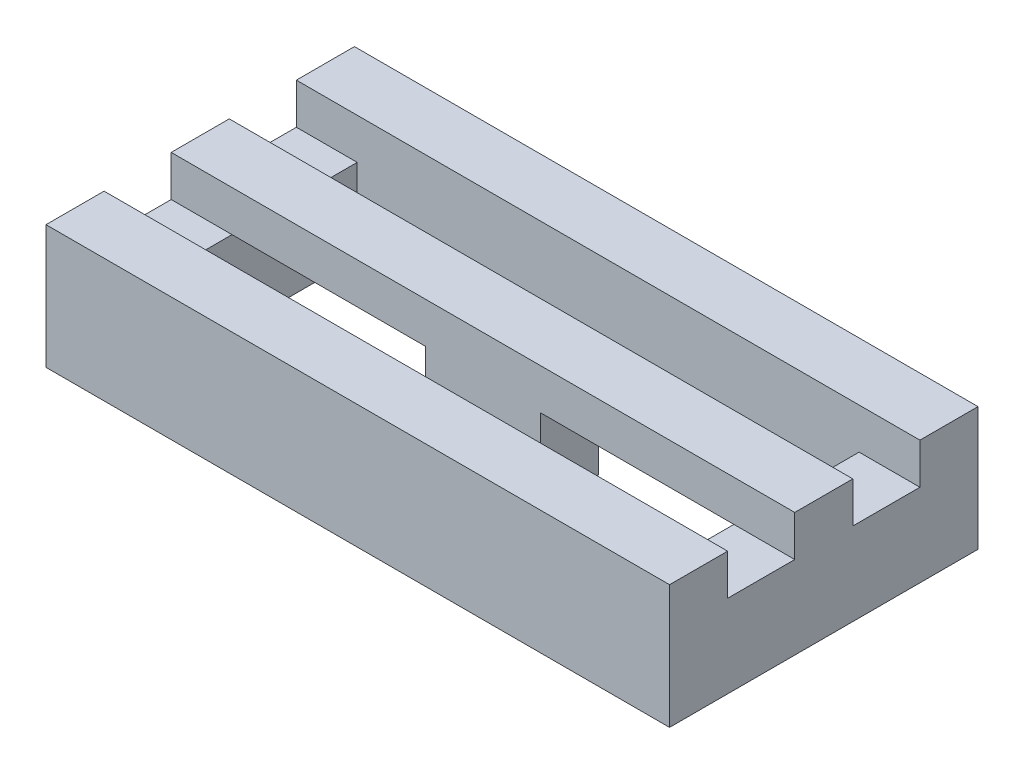
ISO-10303-21;
HEADER;
FILE_DESCRIPTION(('STEP AP214'),'2;1');
FILE_NAME('part.step','',(''),(''),'','','');
FILE_SCHEMA(('AUTOMOTIVE_DESIGN { 1 0 10303 214 1 1 1 1 }'));
ENDSEC;
DATA;
#1=APPLICATION_CONTEXT('core data for automotive mechanical design processes');
#2=APPLICATION_PROTOCOL_DEFINITION('international standard','automotive_design',2000,#1);
#3=PRODUCT_CONTEXT('',#1,'mechanical');
#4=PRODUCT('Part','Part','',(#3));
#5=PRODUCT_RELATED_PRODUCT_CATEGORY('part','',(#4));
#6=PRODUCT_DEFINITION_FORMATION('','',#4);
#7=PRODUCT_DEFINITION_CONTEXT('part definition',#1,'design');
#8=PRODUCT_DEFINITION('design','',#6,#7);
#9=PRODUCT_DEFINITION_SHAPE('','',#8);
#10=(LENGTH_UNIT() NAMED_UNIT(*) SI_UNIT(.MILLI.,.METRE.));
#11=(NAMED_UNIT(*) PLANE_ANGLE_UNIT() SI_UNIT($,.RADIAN.));
#12=(NAMED_UNIT(*) SI_UNIT($,.STERADIAN.) SOLID_ANGLE_UNIT());
#13=UNCERTAINTY_MEASURE_WITH_UNIT(LENGTH_MEASURE(1.E-05),#10,'distance_accuracy_value','');
#14=(GEOMETRIC_REPRESENTATION_CONTEXT(3) GLOBAL_UNCERTAINTY_ASSIGNED_CONTEXT((#13)) GLOBAL_UNIT_ASSIGNED_CONTEXT((#10,
#11,#12)) REPRESENTATION_CONTEXT('',''));
#15=CARTESIAN_POINT('',(0.,0.,0.));
#16=DIRECTION('',(0.,0.,1.));
#17=DIRECTION('',(1.,0.,0.));
#18=AXIS2_PLACEMENT_3D('',#15,#16,#17);
#19=CARTESIAN_POINT('',(0.,-3.15,0.));
#20=DIRECTION('',(0.,1.,0.));
#21=DIRECTION('',(0.,0.,1.));
#22=AXIS2_PLACEMENT_3D('',#19,#20,#21);
#23=PLANE('',#22);
#24=DIRECTION('',(0.,0.,-1.));
#25=VECTOR('',#24,1.);
#26=CARTESIAN_POINT('',(7.945,-3.15,-3.93));
#27=LINE('',#26,#25);
#28=CARTESIAN_POINT('',(7.945,-3.15,3.93));
#29=VERTEX_POINT('',#28);
#30=CARTESIAN_POINT('',(7.945,-3.15,-3.93));
#31=VERTEX_POINT('',#30);
#32=EDGE_CURVE('E316',#29,#31,#27,.T.);
#33=ORIENTED_EDGE('',*,*,#32,.F.);
#34=DIRECTION('',(1.,0.,0.));
#35=VECTOR('',#34,1.);
#36=CARTESIAN_POINT('',(-7.945,-3.15,3.93));
#37=LINE('',#36,#35);
#38=CARTESIAN_POINT('',(-7.945,-3.15,3.93));
#39=VERTEX_POINT('',#38);
#40=EDGE_CURVE('E326',#39,#29,#37,.T.);
#41=ORIENTED_EDGE('',*,*,#40,.F.);
#42=DIRECTION('',(0.,0.,1.));
#43=VECTOR('',#42,1.);
#44=CARTESIAN_POINT('',(-7.945,-3.15,-3.93));
#45=LINE('',#44,#43);
#46=CARTESIAN_POINT('',(-7.945,-3.15,-3.93));
#47=VERTEX_POINT('',#46);
#48=EDGE_CURVE('E323',#47,#39,#45,.T.);
#49=ORIENTED_EDGE('',*,*,#48,.F.);
#50=DIRECTION('',(-1.,0.,0.));
#51=VECTOR('',#50,1.);
#52=CARTESIAN_POINT('',(-7.945,-3.15,-3.93));
#53=LINE('',#52,#51);
#54=EDGE_CURVE('E319',#31,#47,#53,.T.);
#55=ORIENTED_EDGE('',*,*,#54,.F.);
#56=EDGE_LOOP('',(#33,#41,#49,#55));
#57=FACE_BOUND('',#56,.T.);
#58=DIRECTION('',(1.,0.,0.));
#59=VECTOR('',#58,1.);
#60=CARTESIAN_POINT('',(-6.395,-3.15,2.45));
#61=LINE('',#60,#59);
#62=CARTESIAN_POINT('',(-6.395,-3.15,2.45));
#63=VERTEX_POINT('',#62);
#64=CARTESIAN_POINT('',(6.395,-3.15,2.45));
#65=VERTEX_POINT('',#64);
#66=EDGE_CURVE('E248',#63,#65,#61,.T.);
#67=ORIENTED_EDGE('',*,*,#66,.T.);
#68=DIRECTION('',(0.,0.,-1.));
#69=VECTOR('',#68,1.);
#70=CARTESIAN_POINT('',(6.395,-3.15,-0.74));
#71=LINE('',#70,#69);
#72=CARTESIAN_POINT('',(6.395,-3.15,-2.45));
#73=VERTEX_POINT('',#72);
#74=EDGE_CURVE('E235',#65,#73,#71,.T.);
#75=ORIENTED_EDGE('',*,*,#74,.T.);
#76=DIRECTION('',(-1.,0.,0.));
#77=VECTOR('',#76,1.);
#78=CARTESIAN_POINT('',(6.395,-3.15,-2.45));
#79=LINE('',#78,#77);
#80=CARTESIAN_POINT('',(-6.395,-3.15,-2.45));
#81=VERTEX_POINT('',#80);
#82=EDGE_CURVE('E228',#73,#81,#79,.T.);
#83=ORIENTED_EDGE('',*,*,#82,.T.);
#84=DIRECTION('',(0.,0.,1.));
#85=VECTOR('',#84,1.);
#86=CARTESIAN_POINT('',(-6.395,-3.15,-2.45));
#87=LINE('',#86,#85);
#88=EDGE_CURVE('E48',#81,#63,#87,.T.);
#89=ORIENTED_EDGE('',*,*,#88,.T.);
#90=EDGE_LOOP('',(#67,#75,#83,#89));
#91=FACE_BOUND('',#90,.T.);
#92=ADVANCED_FACE('F33',(#57,#91),#23,.F.);
#93=CARTESIAN_POINT('',(-7.945,-1.04,2.45));
#94=DIRECTION('',(0.,-1.,0.));
#95=DIRECTION('',(0.,0.,-1.));
#96=AXIS2_PLACEMENT_3D('',#93,#94,#95);
#97=PLANE('',#96);
#98=DIRECTION('',(1.,0.,0.));
#99=VECTOR('',#98,1.);
#100=CARTESIAN_POINT('',(-7.945,-1.04,0.74));
#101=LINE('',#100,#99);
#102=CARTESIAN_POINT('',(6.395,-1.04,0.74));
#103=VERTEX_POINT('',#102);
#104=CARTESIAN_POINT('',(7.945,-1.04,0.74));
#105=VERTEX_POINT('',#104);
#106=EDGE_CURVE('E310',#103,#105,#101,.T.);
#107=ORIENTED_EDGE('',*,*,#106,.F.);
#108=DIRECTION('',(0.,0.,-1.));
#109=VECTOR('',#108,1.);
#110=CARTESIAN_POINT('',(6.395,-1.04,2.45));
#111=LINE('',#110,#109);
#112=CARTESIAN_POINT('',(6.395,-1.04,2.45));
#113=VERTEX_POINT('',#112);
#114=EDGE_CURVE('E249',#113,#103,#111,.T.);
#115=ORIENTED_EDGE('',*,*,#114,.F.);
#116=DIRECTION('',(1.,0.,0.));
#117=VECTOR('',#116,1.);
#118=CARTESIAN_POINT('',(-7.945,-1.04,2.45));
#119=LINE('',#118,#117);
#120=CARTESIAN_POINT('',(7.945,-1.04,2.45));
#121=VERTEX_POINT('',#120);
#122=EDGE_CURVE('E314',#113,#121,#119,.T.);
#123=ORIENTED_EDGE('',*,*,#122,.T.);
#124=DIRECTION('',(0.,0.,-1.));
#125=VECTOR('',#124,1.);
#126=CARTESIAN_POINT('',(7.945,-1.04,2.45));
#127=LINE('',#126,#125);
#128=EDGE_CURVE('E301',#121,#105,#127,.T.);
#129=ORIENTED_EDGE('',*,*,#128,.T.);
#130=EDGE_LOOP('',(#107,#115,#123,#129));
#131=FACE_BOUND('',#130,.T.);
#132=ADVANCED_FACE('F382',(#131),#97,.F.);
#133=CARTESIAN_POINT('',(-7.945,-1.04,-0.74));
#134=DIRECTION('',(0.,-1.,0.));
#135=DIRECTION('',(0.,0.,-1.));
#136=AXIS2_PLACEMENT_3D('',#133,#134,#135);
#137=PLANE('',#136);
#138=DIRECTION('',(1.,0.,0.));
#139=VECTOR('',#138,1.);
#140=CARTESIAN_POINT('',(-7.945,-1.04,-2.45));
#141=LINE('',#140,#139);
#142=CARTESIAN_POINT('',(6.395,-1.04,-2.45));
#143=VERTEX_POINT('',#142);
#144=CARTESIAN_POINT('',(7.945,-1.04,-2.45));
#145=VERTEX_POINT('',#144);
#146=EDGE_CURVE('E282',#143,#145,#141,.T.);
#147=ORIENTED_EDGE('',*,*,#146,.F.);
#148=DIRECTION('',(0.,0.,-1.));
#149=VECTOR('',#148,1.);
#150=CARTESIAN_POINT('',(6.395,-1.04,-0.74));
#151=LINE('',#150,#149);
#152=CARTESIAN_POINT('',(6.395,-1.04,-0.74));
#153=VERTEX_POINT('',#152);
#154=EDGE_CURVE('E230',#153,#143,#151,.T.);
#155=ORIENTED_EDGE('',*,*,#154,.F.);
#156=DIRECTION('',(1.,0.,0.));
#157=VECTOR('',#156,1.);
#158=CARTESIAN_POINT('',(-7.945,-1.04,-0.74));
#159=LINE('',#158,#157);
#160=CARTESIAN_POINT('',(7.945,-1.04,-0.74));
#161=VERTEX_POINT('',#160);
#162=EDGE_CURVE('E286',#153,#161,#159,.T.);
#163=ORIENTED_EDGE('',*,*,#162,.T.);
#164=DIRECTION('',(0.,0.,-1.));
#165=VECTOR('',#164,1.);
#166=CARTESIAN_POINT('',(7.945,-1.04,-0.74));
#167=LINE('',#166,#165);
#168=EDGE_CURVE('E270',#161,#145,#167,.T.);
#169=ORIENTED_EDGE('',*,*,#168,.T.);
#170=EDGE_LOOP('',(#147,#155,#163,#169));
#171=FACE_BOUND('',#170,.T.);
#172=ADVANCED_FACE('F371',(#171),#137,.F.);
#173=CARTESIAN_POINT('',(0.,0.,0.));
#174=DIRECTION('',(0.,1.,0.));
#175=DIRECTION('',(0.,0.,1.));
#176=AXIS2_PLACEMENT_3D('',#173,#174,#175);
#177=PLANE('',#176);
#178=DIRECTION('',(1.,0.,0.));
#179=VECTOR('',#178,1.);
#180=CARTESIAN_POINT('',(-7.945,0.,-2.45));
#181=LINE('',#180,#179);
#182=CARTESIAN_POINT('',(-7.945,0.,-2.45));
#183=VERTEX_POINT('',#182);
#184=CARTESIAN_POINT('',(7.945,0.,-2.45));
#185=VERTEX_POINT('',#184);
#186=EDGE_CURVE('E275',#183,#185,#181,.T.);
#187=ORIENTED_EDGE('',*,*,#186,.T.);
#188=DIRECTION('',(0.,0.,-1.));
#189=VECTOR('',#188,1.);
#190=CARTESIAN_POINT('',(7.945,0.,-3.93));
#191=LINE('',#190,#189);
#192=CARTESIAN_POINT('',(7.945,0.,-3.93));
#193=VERTEX_POINT('',#192);
#194=EDGE_CURVE('E278',#185,#193,#191,.T.);
#195=ORIENTED_EDGE('',*,*,#194,.T.);
#196=DIRECTION('',(-1.,0.,0.));
#197=VECTOR('',#196,1.);
#198=CARTESIAN_POINT('',(-7.945,0.,-3.93));
#199=LINE('',#198,#197);
#200=CARTESIAN_POINT('',(-7.945,0.,-3.93));
#201=VERTEX_POINT('',#200);
#202=EDGE_CURVE('E333',#193,#201,#199,.T.);
#203=ORIENTED_EDGE('',*,*,#202,.T.);
#204=DIRECTION('',(0.,0.,1.));
#205=VECTOR('',#204,1.);
#206=CARTESIAN_POINT('',(-7.945,0.,-3.93));
#207=LINE('',#206,#205);
#208=EDGE_CURVE('E338',#201,#183,#207,.T.);
#209=ORIENTED_EDGE('',*,*,#208,.T.);
#210=EDGE_LOOP('',(#187,#195,#203,#209));
#211=FACE_BOUND('',#210,.T.);
#212=ADVANCED_FACE('F402',(#211),#177,.T.);
#213=DIRECTION('',(1.,0.,0.));
#214=VECTOR('',#213,1.);
#215=CARTESIAN_POINT('',(-7.945,0.,-0.74));
#216=LINE('',#215,#214);
#217=CARTESIAN_POINT('',(-7.945,0.,-0.74));
#218=VERTEX_POINT('',#217);
#219=CARTESIAN_POINT('',(7.945,0.,-0.74));
#220=VERTEX_POINT('',#219);
#221=EDGE_CURVE('E266',#218,#220,#216,.T.);
#222=ORIENTED_EDGE('',*,*,#221,.F.);
#223=CARTESIAN_POINT('',(-7.945,0.,0.74));
#224=VERTEX_POINT('',#223);
#225=EDGE_CURVE('E341',#218,#224,#207,.T.);
#226=ORIENTED_EDGE('',*,*,#225,.T.);
#227=DIRECTION('',(1.,0.,0.));
#228=VECTOR('',#227,1.);
#229=CARTESIAN_POINT('',(-7.945,0.,0.74));
#230=LINE('',#229,#228);
#231=CARTESIAN_POINT('',(7.945,0.,0.74));
#232=VERTEX_POINT('',#231);
#233=EDGE_CURVE('E271',#224,#232,#230,.T.);
#234=ORIENTED_EDGE('',*,*,#233,.T.);
#235=EDGE_CURVE('E334',#232,#220,#191,.T.);
#236=ORIENTED_EDGE('',*,*,#235,.T.);
#237=EDGE_LOOP('',(#222,#226,#234,#236));
#238=FACE_BOUND('',#237,.T.);
#239=ADVANCED_FACE('F403',(#238),#177,.T.);
#240=CARTESIAN_POINT('',(7.945,-3.15,-3.93));
#241=DIRECTION('',(1.,0.,0.));
#242=DIRECTION('',(0.,0.,-1.));
#243=AXIS2_PLACEMENT_3D('',#240,#241,#242);
#244=PLANE('',#243);
#245=DIRECTION('',(0.,1.,0.));
#246=VECTOR('',#245,1.);
#247=CARTESIAN_POINT('',(7.945,-1.04,-2.45));
#248=LINE('',#247,#246);
#249=EDGE_CURVE('E260',#145,#185,#248,.T.);
#250=ORIENTED_EDGE('',*,*,#249,.F.);
#251=ORIENTED_EDGE('',*,*,#168,.F.);
#252=DIRECTION('',(0.,-1.,0.));
#253=VECTOR('',#252,1.);
#254=CARTESIAN_POINT('',(7.945,0.,-0.74));
#255=LINE('',#254,#253);
#256=EDGE_CURVE('E267',#220,#161,#255,.T.);
#257=ORIENTED_EDGE('',*,*,#256,.F.);
#258=ORIENTED_EDGE('',*,*,#235,.F.);
#259=DIRECTION('',(0.,1.,0.));
#260=VECTOR('',#259,1.);
#261=CARTESIAN_POINT('',(7.945,-1.04,0.74));
#262=LINE('',#261,#260);
#263=EDGE_CURVE('E292',#105,#232,#262,.T.);
#264=ORIENTED_EDGE('',*,*,#263,.F.);
#265=ORIENTED_EDGE('',*,*,#128,.F.);
#266=DIRECTION('',(0.,-1.,0.));
#267=VECTOR('',#266,1.);
#268=CARTESIAN_POINT('',(7.945,0.,2.45));
#269=LINE('',#268,#267);
#270=CARTESIAN_POINT('',(7.945,0.,2.45));
#271=VERTEX_POINT('',#270);
#272=EDGE_CURVE('E245',#271,#121,#269,.T.);
#273=ORIENTED_EDGE('',*,*,#272,.F.);
#274=CARTESIAN_POINT('',(7.945,0.,3.93));
#275=VERTEX_POINT('',#274);
#276=EDGE_CURVE('E330',#275,#271,#191,.T.);
#277=ORIENTED_EDGE('',*,*,#276,.F.);
#278=DIRECTION('',(0.,1.,0.));
#279=VECTOR('',#278,1.);
#280=CARTESIAN_POINT('',(7.945,-3.15,3.93));
#281=LINE('',#280,#279);
#282=EDGE_CURVE('E344',#29,#275,#281,.T.);
#283=ORIENTED_EDGE('',*,*,#282,.F.);
#284=ORIENTED_EDGE('',*,*,#32,.T.);
#285=DIRECTION('',(0.,1.,0.));
#286=VECTOR('',#285,1.);
#287=CARTESIAN_POINT('',(7.945,-3.15,-3.93));
#288=LINE('',#287,#286);
#289=EDGE_CURVE('E329',#31,#193,#288,.T.);
#290=ORIENTED_EDGE('',*,*,#289,.T.);
#291=ORIENTED_EDGE('',*,*,#194,.F.);
#292=EDGE_LOOP('',(#250,#251,#257,#258,#264,#265,#273,#277,#283,#284,#290,#291));
#293=FACE_BOUND('',#292,.T.);
#294=ADVANCED_FACE('F35',(#293),#244,.T.);
#295=CARTESIAN_POINT('',(-7.945,-3.15,3.93));
#296=DIRECTION('',(0.,0.,1.));
#297=DIRECTION('',(1.,0.,0.));
#298=AXIS2_PLACEMENT_3D('',#295,#296,#297);
#299=PLANE('',#298);
#300=DIRECTION('',(1.,0.,0.));
#301=VECTOR('',#300,1.);
#302=CARTESIAN_POINT('',(-7.945,0.,3.93));
#303=LINE('',#302,#301);
#304=CARTESIAN_POINT('',(-7.945,0.,3.93));
#305=VERTEX_POINT('',#304);
#306=EDGE_CURVE('E320',#305,#275,#303,.T.);
#307=ORIENTED_EDGE('',*,*,#306,.F.);
#308=DIRECTION('',(0.,1.,0.));
#309=VECTOR('',#308,1.);
#310=CARTESIAN_POINT('',(-7.945,-3.15,3.93));
#311=LINE('',#310,#309);
#312=EDGE_CURVE('E346',#39,#305,#311,.T.);
#313=ORIENTED_EDGE('',*,*,#312,.F.);
#314=ORIENTED_EDGE('',*,*,#40,.T.);
#315=ORIENTED_EDGE('',*,*,#282,.T.);
#316=EDGE_LOOP('',(#307,#313,#314,#315));
#317=FACE_BOUND('',#316,.T.);
#318=ADVANCED_FACE('F409',(#317),#299,.T.);
#319=CARTESIAN_POINT('',(-7.945,-3.15,-3.93));
#320=DIRECTION('',(-1.,0.,0.));
#321=DIRECTION('',(0.,0.,1.));
#322=AXIS2_PLACEMENT_3D('',#319,#320,#321);
#323=PLANE('',#322);
#324=DIRECTION('',(0.,1.,0.));
#325=VECTOR('',#324,1.);
#326=CARTESIAN_POINT('',(-7.945,-1.04,-2.45));
#327=LINE('',#326,#325);
#328=CARTESIAN_POINT('',(-7.945,-1.04,-2.45));
#329=VERTEX_POINT('',#328);
#330=EDGE_CURVE('E263',#329,#183,#327,.T.);
#331=ORIENTED_EDGE('',*,*,#330,.T.);
#332=ORIENTED_EDGE('',*,*,#208,.F.);
#333=DIRECTION('',(0.,1.,0.));
#334=VECTOR('',#333,1.);
#335=CARTESIAN_POINT('',(-7.945,-3.15,-3.93));
#336=LINE('',#335,#334);
#337=EDGE_CURVE('E349',#47,#201,#336,.T.);
#338=ORIENTED_EDGE('',*,*,#337,.F.);
#339=ORIENTED_EDGE('',*,*,#48,.T.);
#340=ORIENTED_EDGE('',*,*,#312,.T.);
#341=CARTESIAN_POINT('',(-7.945,0.,2.45));
#342=VERTEX_POINT('',#341);
#343=EDGE_CURVE('E337',#342,#305,#207,.T.);
#344=ORIENTED_EDGE('',*,*,#343,.F.);
#345=DIRECTION('',(0.,-1.,0.));
#346=VECTOR('',#345,1.);
#347=CARTESIAN_POINT('',(-7.945,0.,2.45));
#348=LINE('',#347,#346);
#349=CARTESIAN_POINT('',(-7.945,-1.04,2.45));
#350=VERTEX_POINT('',#349);
#351=EDGE_CURVE('E288',#342,#350,#348,.T.);
#352=ORIENTED_EDGE('',*,*,#351,.T.);
#353=DIRECTION('',(0.,0.,-1.));
#354=VECTOR('',#353,1.);
#355=CARTESIAN_POINT('',(-7.945,-1.04,2.45));
#356=LINE('',#355,#354);
#357=CARTESIAN_POINT('',(-7.945,-1.04,0.74));
#358=VERTEX_POINT('',#357);
#359=EDGE_CURVE('E291',#350,#358,#356,.T.);
#360=ORIENTED_EDGE('',*,*,#359,.T.);
#361=DIRECTION('',(0.,1.,0.));
#362=VECTOR('',#361,1.);
#363=CARTESIAN_POINT('',(-7.945,-1.04,0.74));
#364=LINE('',#363,#362);
#365=EDGE_CURVE('E295',#358,#224,#364,.T.);
#366=ORIENTED_EDGE('',*,*,#365,.T.);
#367=ORIENTED_EDGE('',*,*,#225,.F.);
#368=DIRECTION('',(0.,-1.,0.));
#369=VECTOR('',#368,1.);
#370=CARTESIAN_POINT('',(-7.945,0.,-0.74));
#371=LINE('',#370,#369);
#372=CARTESIAN_POINT('',(-7.945,-1.04,-0.74));
#373=VERTEX_POINT('',#372);
#374=EDGE_CURVE('E256',#218,#373,#371,.T.);
#375=ORIENTED_EDGE('',*,*,#374,.T.);
#376=DIRECTION('',(0.,0.,-1.));
#377=VECTOR('',#376,1.);
#378=CARTESIAN_POINT('',(-7.945,-1.04,-0.74));
#379=LINE('',#378,#377);
#380=EDGE_CURVE('E259',#373,#329,#379,.T.);
#381=ORIENTED_EDGE('',*,*,#380,.T.);
#382=EDGE_LOOP('',(#331,#332,#338,#339,#340,#344,#352,#360,#366,#367,#375,#381));
#383=FACE_BOUND('',#382,.T.);
#384=ADVANCED_FACE('F404',(#383),#323,.T.);
#385=CARTESIAN_POINT('',(-7.945,-3.15,-3.93));
#386=DIRECTION('',(0.,0.,-1.));
#387=DIRECTION('',(-1.,0.,0.));
#388=AXIS2_PLACEMENT_3D('',#385,#386,#387);
#389=PLANE('',#388);
#390=ORIENTED_EDGE('',*,*,#202,.F.);
#391=ORIENTED_EDGE('',*,*,#289,.F.);
#392=ORIENTED_EDGE('',*,*,#54,.T.);
#393=ORIENTED_EDGE('',*,*,#337,.T.);
#394=EDGE_LOOP('',(#390,#391,#392,#393));
#395=FACE_BOUND('',#394,.T.);
#396=ADVANCED_FACE('F396',(#395),#389,.T.);
#397=DIRECTION('',(1.,0.,0.));
#398=VECTOR('',#397,1.);
#399=CARTESIAN_POINT('',(-6.395,-3.15,-0.74));
#400=LINE('',#399,#398);
#401=CARTESIAN_POINT('',(-1.465,-3.15,-0.739999999999999));
#402=VERTEX_POINT('',#401);
#403=CARTESIAN_POINT('',(1.465,-3.15,-0.739999999999999));
#404=VERTEX_POINT('',#403);
#405=EDGE_CURVE('E232',#402,#404,#400,.T.);
#406=ORIENTED_EDGE('',*,*,#405,.T.);
#407=DIRECTION('',(0.,0.,1.));
#408=VECTOR('',#407,1.);
#409=CARTESIAN_POINT('',(1.465,-3.15,-0.86));
#410=LINE('',#409,#408);
#411=CARTESIAN_POINT('',(1.465,-3.15,0.74));
#412=VERTEX_POINT('',#411);
#413=EDGE_CURVE('E193',#404,#412,#410,.T.);
#414=ORIENTED_EDGE('',*,*,#413,.T.);
#415=DIRECTION('',(-1.,0.,0.));
#416=VECTOR('',#415,1.);
#417=CARTESIAN_POINT('',(6.395,-3.15,0.74));
#418=LINE('',#417,#416);
#419=CARTESIAN_POINT('',(-1.465,-3.15,0.74));
#420=VERTEX_POINT('',#419);
#421=EDGE_CURVE('E208',#412,#420,#418,.T.);
#422=ORIENTED_EDGE('',*,*,#421,.T.);
#423=DIRECTION('',(0.,0.,1.));
#424=VECTOR('',#423,1.);
#425=CARTESIAN_POINT('',(-1.465,-3.15,-0.86));
#426=LINE('',#425,#424);
#427=EDGE_CURVE('E219',#402,#420,#426,.T.);
#428=ORIENTED_EDGE('',*,*,#427,.F.);
#429=EDGE_LOOP('',(#406,#414,#422,#428));
#430=FACE_BOUND('',#429,.T.);
#431=ADVANCED_FACE('F362',(#430),#23,.F.);
#432=DIRECTION('',(1.,0.,0.));
#433=VECTOR('',#432,1.);
#434=CARTESIAN_POINT('',(-7.945,0.,2.45));
#435=LINE('',#434,#433);
#436=EDGE_CURVE('E298',#342,#271,#435,.T.);
#437=ORIENTED_EDGE('',*,*,#436,.F.);
#438=ORIENTED_EDGE('',*,*,#343,.T.);
#439=ORIENTED_EDGE('',*,*,#306,.T.);
#440=ORIENTED_EDGE('',*,*,#276,.T.);
#441=EDGE_LOOP('',(#437,#438,#439,#440));
#442=FACE_BOUND('',#441,.T.);
#443=ADVANCED_FACE('F395',(#442),#177,.T.);
#444=CARTESIAN_POINT('',(-7.945,-1.04,0.74));
#445=DIRECTION('',(0.,0.,-1.));
#446=DIRECTION('',(-1.,0.,0.));
#447=AXIS2_PLACEMENT_3D('',#444,#445,#446);
#448=PLANE('',#447);
#449=DIRECTION('',(0.,-1.,0.));
#450=VECTOR('',#449,1.);
#451=CARTESIAN_POINT('',(1.465,-3.15,0.74));
#452=LINE('',#451,#450);
#453=CARTESIAN_POINT('',(1.465,-1.04,0.74));
#454=VERTEX_POINT('',#453);
#455=EDGE_CURVE('E189',#454,#412,#452,.T.);
#456=ORIENTED_EDGE('',*,*,#455,.F.);
#457=DIRECTION('',(-1.,0.,0.));
#458=VECTOR('',#457,1.);
#459=CARTESIAN_POINT('',(1.465,-1.04,0.74));
#460=LINE('',#459,#458);
#461=EDGE_CURVE('E196',#103,#454,#460,.T.);
#462=ORIENTED_EDGE('',*,*,#461,.F.);
#463=ORIENTED_EDGE('',*,*,#106,.T.);
#464=ORIENTED_EDGE('',*,*,#263,.T.);
#465=ORIENTED_EDGE('',*,*,#233,.F.);
#466=ORIENTED_EDGE('',*,*,#365,.F.);
#467=CARTESIAN_POINT('',(-6.395,-1.04,0.74));
#468=VERTEX_POINT('',#467);
#469=EDGE_CURVE('E307',#358,#468,#101,.T.);
#470=ORIENTED_EDGE('',*,*,#469,.T.);
#471=DIRECTION('',(-1.,0.,0.));
#472=VECTOR('',#471,1.);
#473=CARTESIAN_POINT('',(-6.395,-1.04,0.74));
#474=LINE('',#473,#472);
#475=CARTESIAN_POINT('',(-1.465,-1.04,0.74));
#476=VERTEX_POINT('',#475);
#477=EDGE_CURVE('E217',#476,#468,#474,.T.);
#478=ORIENTED_EDGE('',*,*,#477,.F.);
#479=DIRECTION('',(0.,1.,0.));
#480=VECTOR('',#479,1.);
#481=CARTESIAN_POINT('',(-1.465,-1.04,0.74));
#482=LINE('',#481,#480);
#483=EDGE_CURVE('E214',#420,#476,#482,.T.);
#484=ORIENTED_EDGE('',*,*,#483,.F.);
#485=ORIENTED_EDGE('',*,*,#421,.F.);
#486=EDGE_LOOP('',(#456,#462,#463,#464,#465,#466,#470,#478,#484,#485));
#487=FACE_BOUND('',#486,.T.);
#488=ADVANCED_FACE('F205',(#487),#448,.F.);
#489=CARTESIAN_POINT('',(-6.395,-1.04,2.45));
#490=VERTEX_POINT('',#489);
#491=EDGE_CURVE('E311',#350,#490,#119,.T.);
#492=ORIENTED_EDGE('',*,*,#491,.T.);
#493=DIRECTION('',(0.,0.,1.));
#494=VECTOR('',#493,1.);
#495=CARTESIAN_POINT('',(-6.395,-1.04,0.74));
#496=LINE('',#495,#494);
#497=EDGE_CURVE('E56',#468,#490,#496,.T.);
#498=ORIENTED_EDGE('',*,*,#497,.F.);
#499=ORIENTED_EDGE('',*,*,#469,.F.);
#500=ORIENTED_EDGE('',*,*,#359,.F.);
#501=EDGE_LOOP('',(#492,#498,#499,#500));
#502=FACE_BOUND('',#501,.T.);
#503=ADVANCED_FACE('F390',(#502),#97,.F.);
#504=CARTESIAN_POINT('',(-7.945,0.,2.45));
#505=DIRECTION('',(0.,0.,1.));
#506=DIRECTION('',(1.,0.,0.));
#507=AXIS2_PLACEMENT_3D('',#504,#505,#506);
#508=PLANE('',#507);
#509=ORIENTED_EDGE('',*,*,#272,.T.);
#510=ORIENTED_EDGE('',*,*,#122,.F.);
#511=DIRECTION('',(0.,1.,0.));
#512=VECTOR('',#511,1.);
#513=CARTESIAN_POINT('',(6.395,-3.15,2.45));
#514=LINE('',#513,#512);
#515=EDGE_CURVE('E240',#65,#113,#514,.T.);
#516=ORIENTED_EDGE('',*,*,#515,.F.);
#517=ORIENTED_EDGE('',*,*,#66,.F.);
#518=DIRECTION('',(0.,1.,0.));
#519=VECTOR('',#518,1.);
#520=CARTESIAN_POINT('',(-6.395,-3.15,2.45));
#521=LINE('',#520,#519);
#522=EDGE_CURVE('E251',#63,#490,#521,.T.);
#523=ORIENTED_EDGE('',*,*,#522,.T.);
#524=ORIENTED_EDGE('',*,*,#491,.F.);
#525=ORIENTED_EDGE('',*,*,#351,.F.);
#526=ORIENTED_EDGE('',*,*,#436,.T.);
#527=EDGE_LOOP('',(#509,#510,#516,#517,#523,#524,#525,#526));
#528=FACE_BOUND('',#527,.T.);
#529=ADVANCED_FACE('F380',(#528),#508,.F.);
#530=CARTESIAN_POINT('',(-7.945,-1.04,-2.45));
#531=DIRECTION('',(0.,0.,-1.));
#532=DIRECTION('',(0.,1.,0.));
#533=AXIS2_PLACEMENT_3D('',#530,#531,#532);
#534=PLANE('',#533);
#535=ORIENTED_EDGE('',*,*,#249,.T.);
#536=ORIENTED_EDGE('',*,*,#186,.F.);
#537=ORIENTED_EDGE('',*,*,#330,.F.);
#538=CARTESIAN_POINT('',(-6.395,-1.04,-2.45));
#539=VERTEX_POINT('',#538);
#540=EDGE_CURVE('E279',#329,#539,#141,.T.);
#541=ORIENTED_EDGE('',*,*,#540,.T.);
#542=DIRECTION('',(0.,1.,0.));
#543=VECTOR('',#542,1.);
#544=CARTESIAN_POINT('',(-6.395,-3.15,-2.45));
#545=LINE('',#544,#543);
#546=EDGE_CURVE('E237',#81,#539,#545,.T.);
#547=ORIENTED_EDGE('',*,*,#546,.F.);
#548=ORIENTED_EDGE('',*,*,#82,.F.);
#549=DIRECTION('',(0.,1.,0.));
#550=VECTOR('',#549,1.);
#551=CARTESIAN_POINT('',(6.395,-3.15,-2.45));
#552=LINE('',#551,#550);
#553=EDGE_CURVE('E242',#73,#143,#552,.T.);
#554=ORIENTED_EDGE('',*,*,#553,.T.);
#555=ORIENTED_EDGE('',*,*,#146,.T.);
#556=EDGE_LOOP('',(#535,#536,#537,#541,#547,#548,#554,#555));
#557=FACE_BOUND('',#556,.T.);
#558=ADVANCED_FACE('F375',(#557),#534,.F.);
#559=CARTESIAN_POINT('',(-6.395,-1.04,-0.74));
#560=VERTEX_POINT('',#559);
#561=EDGE_CURVE('E283',#373,#560,#159,.T.);
#562=ORIENTED_EDGE('',*,*,#561,.T.);
#563=DIRECTION('',(0.,0.,1.));
#564=VECTOR('',#563,1.);
#565=CARTESIAN_POINT('',(-6.395,-1.04,-2.45));
#566=LINE('',#565,#564);
#567=EDGE_CURVE('E238',#539,#560,#566,.T.);
#568=ORIENTED_EDGE('',*,*,#567,.F.);
#569=ORIENTED_EDGE('',*,*,#540,.F.);
#570=ORIENTED_EDGE('',*,*,#380,.F.);
#571=EDGE_LOOP('',(#562,#568,#569,#570));
#572=FACE_BOUND('',#571,.T.);
#573=ADVANCED_FACE('F447',(#572),#137,.F.);
#574=CARTESIAN_POINT('',(-7.945,0.,-0.74));
#575=DIRECTION('',(0.,0.,1.));
#576=DIRECTION('',(0.,-1.,0.));
#577=AXIS2_PLACEMENT_3D('',#574,#575,#576);
#578=PLANE('',#577);
#579=ORIENTED_EDGE('',*,*,#162,.F.);
#580=DIRECTION('',(-1.,0.,0.));
#581=VECTOR('',#580,1.);
#582=CARTESIAN_POINT('',(-7.945,-1.04,-0.74));
#583=LINE('',#582,#581);
#584=CARTESIAN_POINT('',(1.465,-1.04,-0.739999999999999));
#585=VERTEX_POINT('',#584);
#586=EDGE_CURVE('E226',#153,#585,#583,.T.);
#587=ORIENTED_EDGE('',*,*,#586,.T.);
#588=DIRECTION('',(0.,-1.,0.));
#589=VECTOR('',#588,1.);
#590=CARTESIAN_POINT('',(1.465,0.,-0.74));
#591=LINE('',#590,#589);
#592=EDGE_CURVE('E11',#585,#404,#591,.T.);
#593=ORIENTED_EDGE('',*,*,#592,.T.);
#594=ORIENTED_EDGE('',*,*,#405,.F.);
#595=DIRECTION('',(0.,1.,0.));
#596=VECTOR('',#595,1.);
#597=CARTESIAN_POINT('',(-1.465,0.,-0.74));
#598=LINE('',#597,#596);
#599=CARTESIAN_POINT('',(-1.465,-1.04,-0.739999999999999));
#600=VERTEX_POINT('',#599);
#601=EDGE_CURVE('E41',#402,#600,#598,.T.);
#602=ORIENTED_EDGE('',*,*,#601,.T.);
#603=DIRECTION('',(-1.,0.,0.));
#604=VECTOR('',#603,1.);
#605=CARTESIAN_POINT('',(-7.945,-1.04,-0.74));
#606=LINE('',#605,#604);
#607=EDGE_CURVE('E212',#600,#560,#606,.T.);
#608=ORIENTED_EDGE('',*,*,#607,.T.);
#609=ORIENTED_EDGE('',*,*,#561,.F.);
#610=ORIENTED_EDGE('',*,*,#374,.F.);
#611=ORIENTED_EDGE('',*,*,#221,.T.);
#612=ORIENTED_EDGE('',*,*,#256,.T.);
#613=EDGE_LOOP('',(#579,#587,#593,#594,#602,#608,#609,#610,#611,#612));
#614=FACE_BOUND('',#613,.T.);
#615=ADVANCED_FACE('F356',(#614),#578,.F.);
#616=CARTESIAN_POINT('',(6.395,-3.15,-0.74));
#617=DIRECTION('',(1.,0.,0.));
#618=DIRECTION('',(0.,0.,-1.));
#619=AXIS2_PLACEMENT_3D('',#616,#617,#618);
#620=PLANE('',#619);
#621=ORIENTED_EDGE('',*,*,#553,.F.);
#622=ORIENTED_EDGE('',*,*,#74,.F.);
#623=ORIENTED_EDGE('',*,*,#515,.T.);
#624=ORIENTED_EDGE('',*,*,#114,.T.);
#625=DIRECTION('',(0.,0.,1.));
#626=VECTOR('',#625,1.);
#627=CARTESIAN_POINT('',(6.395,-1.04,-0.86));
#628=LINE('',#627,#626);
#629=EDGE_CURVE('E199',#153,#103,#628,.T.);
#630=ORIENTED_EDGE('',*,*,#629,.F.);
#631=ORIENTED_EDGE('',*,*,#154,.T.);
#632=EDGE_LOOP('',(#621,#622,#623,#624,#630,#631));
#633=FACE_BOUND('',#632,.T.);
#634=ADVANCED_FACE('F366',(#633),#620,.F.);
#635=CARTESIAN_POINT('',(-6.395,-3.15,-2.45));
#636=DIRECTION('',(-1.,0.,0.));
#637=DIRECTION('',(0.,0.,1.));
#638=AXIS2_PLACEMENT_3D('',#635,#636,#637);
#639=PLANE('',#638);
#640=ORIENTED_EDGE('',*,*,#567,.T.);
#641=DIRECTION('',(0.,0.,1.));
#642=VECTOR('',#641,1.);
#643=CARTESIAN_POINT('',(-6.395,-1.04,-0.86));
#644=LINE('',#643,#642);
#645=EDGE_CURVE('E202',#560,#468,#644,.T.);
#646=ORIENTED_EDGE('',*,*,#645,.T.);
#647=ORIENTED_EDGE('',*,*,#497,.T.);
#648=ORIENTED_EDGE('',*,*,#522,.F.);
#649=ORIENTED_EDGE('',*,*,#88,.F.);
#650=ORIENTED_EDGE('',*,*,#546,.T.);
#651=EDGE_LOOP('',(#640,#646,#647,#648,#649,#650));
#652=FACE_BOUND('',#651,.T.);
#653=ADVANCED_FACE('F449',(#652),#639,.F.);
#654=CARTESIAN_POINT('',(-1.465,-1.04,-0.86));
#655=DIRECTION('',(1.,0.,0.));
#656=DIRECTION('',(0.,1.,0.));
#657=AXIS2_PLACEMENT_3D('',#654,#655,#656);
#658=PLANE('',#657);
#659=ORIENTED_EDGE('',*,*,#427,.T.);
#660=ORIENTED_EDGE('',*,*,#483,.T.);
#661=DIRECTION('',(0.,0.,1.));
#662=VECTOR('',#661,1.);
#663=CARTESIAN_POINT('',(-1.465,-1.04,-0.86));
#664=LINE('',#663,#662);
#665=EDGE_CURVE('E221',#600,#476,#664,.T.);
#666=ORIENTED_EDGE('',*,*,#665,.F.);
#667=ORIENTED_EDGE('',*,*,#601,.F.);
#668=EDGE_LOOP('',(#659,#660,#666,#667));
#669=FACE_BOUND('',#668,.T.);
#670=ADVANCED_FACE('F360',(#669),#658,.F.);
#671=CARTESIAN_POINT('',(-6.395,-1.04,-0.86));
#672=DIRECTION('',(0.,1.,0.));
#673=DIRECTION('',(0.,0.,1.));
#674=AXIS2_PLACEMENT_3D('',#671,#672,#673);
#675=PLANE('',#674);
#676=ORIENTED_EDGE('',*,*,#665,.T.);
#677=ORIENTED_EDGE('',*,*,#477,.T.);
#678=ORIENTED_EDGE('',*,*,#645,.F.);
#679=ORIENTED_EDGE('',*,*,#607,.F.);
#680=EDGE_LOOP('',(#676,#677,#678,#679));
#681=FACE_BOUND('',#680,.T.);
#682=ADVANCED_FACE('F457',(#681),#675,.F.);
#683=CARTESIAN_POINT('',(1.465,-3.15,-0.86));
#684=DIRECTION('',(-1.,0.,0.));
#685=DIRECTION('',(0.,-1.,0.));
#686=AXIS2_PLACEMENT_3D('',#683,#684,#685);
#687=PLANE('',#686);
#688=DIRECTION('',(0.,0.,1.));
#689=VECTOR('',#688,1.);
#690=CARTESIAN_POINT('',(1.465,-1.04,-0.86));
#691=LINE('',#690,#689);
#692=EDGE_CURVE('E185',#585,#454,#691,.T.);
#693=ORIENTED_EDGE('',*,*,#692,.T.);
#694=ORIENTED_EDGE('',*,*,#455,.T.);
#695=ORIENTED_EDGE('',*,*,#413,.F.);
#696=ORIENTED_EDGE('',*,*,#592,.F.);
#697=EDGE_LOOP('',(#693,#694,#695,#696));
#698=FACE_BOUND('',#697,.T.);
#699=ADVANCED_FACE('F187',(#698),#687,.F.);
#700=CARTESIAN_POINT('',(1.465,-1.04,-0.86));
#701=DIRECTION('',(0.,1.,0.));
#702=DIRECTION('',(0.,0.,1.));
#703=AXIS2_PLACEMENT_3D('',#700,#701,#702);
#704=PLANE('',#703);
#705=ORIENTED_EDGE('',*,*,#629,.T.);
#706=ORIENTED_EDGE('',*,*,#461,.T.);
#707=ORIENTED_EDGE('',*,*,#692,.F.);
#708=ORIENTED_EDGE('',*,*,#586,.F.);
#709=EDGE_LOOP('',(#705,#706,#707,#708));
#710=FACE_BOUND('',#709,.T.);
#711=ADVANCED_FACE('F197',(#710),#704,.F.);
#712=CLOSED_SHELL('',(#92,#132,#172,#212,#239,#294,#318,#384,#396,#431,#443,#488,#503,#529,#558,
#573,#615,#634,#653,#670,#682,#699,#711));
#713=MANIFOLD_SOLID_BREP('B2',#712);
#714=ADVANCED_BREP_SHAPE_REPRESENTATION('',(#18,#713),#14);
#715=SHAPE_DEFINITION_REPRESENTATION(#9,#714);
ENDSEC;
END-ISO-10303-21;
